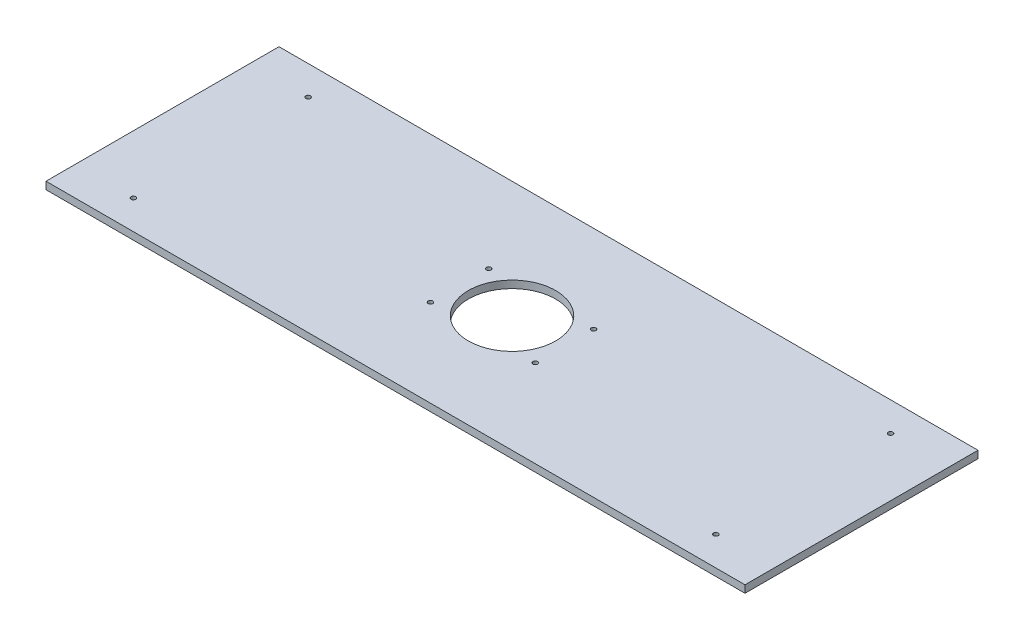
ISO-10303-21;
HEADER;
FILE_DESCRIPTION(('STEP AP214'),'2;1');
FILE_NAME('part.step','',(''),(''),'','','');
FILE_SCHEMA(('AUTOMOTIVE_DESIGN { 1 0 10303 214 1 1 1 1 }'));
ENDSEC;
DATA;
#1=APPLICATION_CONTEXT('core data for automotive mechanical design processes');
#2=APPLICATION_PROTOCOL_DEFINITION('international standard','automotive_design',2000,#1);
#3=PRODUCT_CONTEXT('',#1,'mechanical');
#4=PRODUCT('Part','Part','',(#3));
#5=PRODUCT_RELATED_PRODUCT_CATEGORY('part','',(#4));
#6=PRODUCT_DEFINITION_FORMATION('','',#4);
#7=PRODUCT_DEFINITION_CONTEXT('part definition',#1,'design');
#8=PRODUCT_DEFINITION('design','',#6,#7);
#9=PRODUCT_DEFINITION_SHAPE('','',#8);
#10=(LENGTH_UNIT() NAMED_UNIT(*) SI_UNIT(.MILLI.,.METRE.));
#11=(NAMED_UNIT(*) PLANE_ANGLE_UNIT() SI_UNIT($,.RADIAN.));
#12=(NAMED_UNIT(*) SI_UNIT($,.STERADIAN.) SOLID_ANGLE_UNIT());
#13=UNCERTAINTY_MEASURE_WITH_UNIT(LENGTH_MEASURE(1.E-05),#10,'distance_accuracy_value','');
#14=(GEOMETRIC_REPRESENTATION_CONTEXT(3) GLOBAL_UNCERTAINTY_ASSIGNED_CONTEXT((#13)) GLOBAL_UNIT_ASSIGNED_CONTEXT((#10,
#11,#12)) REPRESENTATION_CONTEXT('',''));
#15=CARTESIAN_POINT('',(0.,0.,0.));
#16=DIRECTION('',(0.,0.,1.));
#17=DIRECTION('',(1.,0.,0.));
#18=AXIS2_PLACEMENT_3D('',#15,#16,#17);
#19=CARTESIAN_POINT('',(0.,12.7,0.));
#20=DIRECTION('',(0.,0.,-1.));
#21=DIRECTION('',(-1.,0.,0.));
#22=AXIS2_PLACEMENT_3D('',#19,#20,#21);
#23=PLANE('',#22);
#24=DIRECTION('',(1.,0.,0.));
#25=VECTOR('',#24,1.);
#26=CARTESIAN_POINT('',(0.,0.,0.));
#27=LINE('',#26,#25);
#28=CARTESIAN_POINT('',(0.,0.,0.));
#29=VERTEX_POINT('',#28);
#30=CARTESIAN_POINT('',(1200.,0.,0.));
#31=VERTEX_POINT('',#30);
#32=EDGE_CURVE('E125',#29,#31,#27,.T.);
#33=ORIENTED_EDGE('',*,*,#32,.T.);
#34=DIRECTION('',(0.,-1.,0.));
#35=VECTOR('',#34,1.);
#36=CARTESIAN_POINT('',(1200.,12.7,0.));
#37=LINE('',#36,#35);
#38=CARTESIAN_POINT('',(1200.,12.7,0.));
#39=VERTEX_POINT('',#38);
#40=EDGE_CURVE('E11',#39,#31,#37,.T.);
#41=ORIENTED_EDGE('',*,*,#40,.F.);
#42=DIRECTION('',(1.,0.,0.));
#43=VECTOR('',#42,1.);
#44=CARTESIAN_POINT('',(0.,12.7,0.));
#45=LINE('',#44,#43);
#46=CARTESIAN_POINT('',(0.,12.7,0.));
#47=VERTEX_POINT('',#46);
#48=EDGE_CURVE('E84',#47,#39,#45,.T.);
#49=ORIENTED_EDGE('',*,*,#48,.F.);
#50=DIRECTION('',(0.,-1.,0.));
#51=VECTOR('',#50,1.);
#52=CARTESIAN_POINT('',(0.,12.7,0.));
#53=LINE('',#52,#51);
#54=EDGE_CURVE('E51',#47,#29,#53,.T.);
#55=ORIENTED_EDGE('',*,*,#54,.T.);
#56=EDGE_LOOP('',(#33,#41,#49,#55));
#57=FACE_BOUND('',#56,.T.);
#58=ADVANCED_FACE('F34',(#57),#23,.F.);
#59=CARTESIAN_POINT('',(1200.,12.7,0.));
#60=DIRECTION('',(-1.,0.,0.));
#61=DIRECTION('',(0.,0.,1.));
#62=AXIS2_PLACEMENT_3D('',#59,#60,#61);
#63=PLANE('',#62);
#64=DIRECTION('',(0.,0.,-1.));
#65=VECTOR('',#64,1.);
#66=CARTESIAN_POINT('',(1200.,0.,0.));
#67=LINE('',#66,#65);
#68=CARTESIAN_POINT('',(1200.,0.,-400.));
#69=VERTEX_POINT('',#68);
#70=EDGE_CURVE('E89',#31,#69,#67,.T.);
#71=ORIENTED_EDGE('',*,*,#70,.T.);
#72=DIRECTION('',(0.,-1.,0.));
#73=VECTOR('',#72,1.);
#74=CARTESIAN_POINT('',(1200.,12.7,-400.));
#75=LINE('',#74,#73);
#76=CARTESIAN_POINT('',(1200.,12.7,-400.));
#77=VERTEX_POINT('',#76);
#78=EDGE_CURVE('E43',#77,#69,#75,.T.);
#79=ORIENTED_EDGE('',*,*,#78,.F.);
#80=DIRECTION('',(0.,0.,-1.));
#81=VECTOR('',#80,1.);
#82=CARTESIAN_POINT('',(1200.,12.7,0.));
#83=LINE('',#82,#81);
#84=EDGE_CURVE('E76',#39,#77,#83,.T.);
#85=ORIENTED_EDGE('',*,*,#84,.F.);
#86=ORIENTED_EDGE('',*,*,#40,.T.);
#87=EDGE_LOOP('',(#71,#79,#85,#86));
#88=FACE_BOUND('',#87,.T.);
#89=ADVANCED_FACE('F88',(#88),#63,.F.);
#90=CARTESIAN_POINT('',(0.,12.7,-400.));
#91=DIRECTION('',(0.,0.,-1.));
#92=DIRECTION('',(-1.,0.,0.));
#93=AXIS2_PLACEMENT_3D('',#90,#91,#92);
#94=PLANE('',#93);
#95=DIRECTION('',(1.,0.,0.));
#96=VECTOR('',#95,1.);
#97=CARTESIAN_POINT('',(0.,0.,-400.));
#98=LINE('',#97,#96);
#99=CARTESIAN_POINT('',(0.,0.,-400.));
#100=VERTEX_POINT('',#99);
#101=EDGE_CURVE('E128',#100,#69,#98,.T.);
#102=ORIENTED_EDGE('',*,*,#101,.F.);
#103=DIRECTION('',(0.,-1.,0.));
#104=VECTOR('',#103,1.);
#105=CARTESIAN_POINT('',(0.,12.7,-400.));
#106=LINE('',#105,#104);
#107=CARTESIAN_POINT('',(0.,12.7,-400.));
#108=VERTEX_POINT('',#107);
#109=EDGE_CURVE('E65',#108,#100,#106,.T.);
#110=ORIENTED_EDGE('',*,*,#109,.F.);
#111=DIRECTION('',(1.,0.,0.));
#112=VECTOR('',#111,1.);
#113=CARTESIAN_POINT('',(0.,12.7,-400.));
#114=LINE('',#113,#112);
#115=EDGE_CURVE('E83',#108,#77,#114,.T.);
#116=ORIENTED_EDGE('',*,*,#115,.T.);
#117=ORIENTED_EDGE('',*,*,#78,.T.);
#118=EDGE_LOOP('',(#102,#110,#116,#117));
#119=FACE_BOUND('',#118,.T.);
#120=ADVANCED_FACE('F92',(#119),#94,.T.);
#121=CARTESIAN_POINT('',(510.,12.7,-150.));
#122=DIRECTION('',(0.,-1.,0.));
#123=DIRECTION('',(0.,0.,-1.));
#124=AXIS2_PLACEMENT_3D('',#121,#122,#123);
#125=CYLINDRICAL_SURFACE('',#124,3.99999999999999);
#126=CARTESIAN_POINT('',(510.,12.7,-150.));
#127=DIRECTION('',(0.,1.,0.));
#128=DIRECTION('',(0.,0.,1.));
#129=AXIS2_PLACEMENT_3D('',#126,#127,#128);
#130=CIRCLE('',#129,3.99999999999999);
#131=CARTESIAN_POINT('',(510.,12.7,-146.));
#132=VERTEX_POINT('',#131);
#133=EDGE_CURVE('E162',#132,#132,#130,.T.);
#134=ORIENTED_EDGE('',*,*,#133,.T.);
#135=EDGE_LOOP('',(#134));
#136=FACE_BOUND('',#135,.T.);
#137=CARTESIAN_POINT('',(510.,0.,-150.));
#138=DIRECTION('',(0.,1.,0.));
#139=DIRECTION('',(0.,0.,1.));
#140=AXIS2_PLACEMENT_3D('',#137,#138,#139);
#141=CIRCLE('',#140,3.99999999999999);
#142=CARTESIAN_POINT('',(510.,0.,-146.));
#143=VERTEX_POINT('',#142);
#144=EDGE_CURVE('E122',#143,#143,#141,.T.);
#145=ORIENTED_EDGE('',*,*,#144,.F.);
#146=EDGE_LOOP('',(#145));
#147=FACE_BOUND('',#146,.T.);
#148=ADVANCED_FACE('F166',(#136,#147),#125,.F.);
#149=CARTESIAN_POINT('',(99.9999999999999,12.7,-350.));
#150=DIRECTION('',(0.,-1.,0.));
#151=DIRECTION('',(0.,0.,-1.));
#152=AXIS2_PLACEMENT_3D('',#149,#150,#151);
#153=CYLINDRICAL_SURFACE('',#152,4.00000000000001);
#154=CARTESIAN_POINT('',(99.9999999999999,12.7,-350.));
#155=DIRECTION('',(0.,1.,0.));
#156=DIRECTION('',(0.,0.,1.));
#157=AXIS2_PLACEMENT_3D('',#154,#155,#156);
#158=CIRCLE('',#157,4.00000000000001);
#159=CARTESIAN_POINT('',(99.9999999999999,12.7,-346.));
#160=VERTEX_POINT('',#159);
#161=EDGE_CURVE('E159',#160,#160,#158,.T.);
#162=ORIENTED_EDGE('',*,*,#161,.T.);
#163=EDGE_LOOP('',(#162));
#164=FACE_BOUND('',#163,.T.);
#165=CARTESIAN_POINT('',(99.9999999999999,0.,-350.));
#166=DIRECTION('',(0.,1.,0.));
#167=DIRECTION('',(0.,0.,1.));
#168=AXIS2_PLACEMENT_3D('',#165,#166,#167);
#169=CIRCLE('',#168,4.00000000000001);
#170=CARTESIAN_POINT('',(99.9999999999999,0.,-346.));
#171=VERTEX_POINT('',#170);
#172=EDGE_CURVE('E119',#171,#171,#169,.T.);
#173=ORIENTED_EDGE('',*,*,#172,.F.);
#174=EDGE_LOOP('',(#173));
#175=FACE_BOUND('',#174,.T.);
#176=ADVANCED_FACE('F192',(#164,#175),#153,.F.);
#177=CARTESIAN_POINT('',(100.,12.7,-50.));
#178=DIRECTION('',(0.,-1.,0.));
#179=DIRECTION('',(0.,0.,-1.));
#180=AXIS2_PLACEMENT_3D('',#177,#178,#179);
#181=CYLINDRICAL_SURFACE('',#180,4.00000000000001);
#182=CARTESIAN_POINT('',(100.,12.7,-50.));
#183=DIRECTION('',(0.,1.,0.));
#184=DIRECTION('',(0.,0.,1.));
#185=AXIS2_PLACEMENT_3D('',#182,#183,#184);
#186=CIRCLE('',#185,4.00000000000001);
#187=CARTESIAN_POINT('',(100.,12.7,-46.));
#188=VERTEX_POINT('',#187);
#189=EDGE_CURVE('E156',#188,#188,#186,.T.);
#190=ORIENTED_EDGE('',*,*,#189,.T.);
#191=EDGE_LOOP('',(#190));
#192=FACE_BOUND('',#191,.T.);
#193=CARTESIAN_POINT('',(100.,0.,-50.));
#194=DIRECTION('',(0.,1.,0.));
#195=DIRECTION('',(0.,0.,1.));
#196=AXIS2_PLACEMENT_3D('',#193,#194,#195);
#197=CIRCLE('',#196,4.00000000000001);
#198=CARTESIAN_POINT('',(100.,0.,-46.));
#199=VERTEX_POINT('',#198);
#200=EDGE_CURVE('E116',#199,#199,#197,.T.);
#201=ORIENTED_EDGE('',*,*,#200,.F.);
#202=EDGE_LOOP('',(#201));
#203=FACE_BOUND('',#202,.T.);
#204=ADVANCED_FACE('F195',(#192,#203),#181,.F.);
#205=CARTESIAN_POINT('',(1100.,12.7,-350.));
#206=DIRECTION('',(0.,-1.,0.));
#207=DIRECTION('',(0.,0.,-1.));
#208=AXIS2_PLACEMENT_3D('',#205,#206,#207);
#209=CYLINDRICAL_SURFACE('',#208,3.99999999999999);
#210=CARTESIAN_POINT('',(1100.,12.7,-350.));
#211=DIRECTION('',(0.,1.,0.));
#212=DIRECTION('',(0.,0.,1.));
#213=AXIS2_PLACEMENT_3D('',#210,#211,#212);
#214=CIRCLE('',#213,3.99999999999999);
#215=CARTESIAN_POINT('',(1100.,12.7,-346.));
#216=VERTEX_POINT('',#215);
#217=EDGE_CURVE('E153',#216,#216,#214,.T.);
#218=ORIENTED_EDGE('',*,*,#217,.T.);
#219=EDGE_LOOP('',(#218));
#220=FACE_BOUND('',#219,.T.);
#221=CARTESIAN_POINT('',(1100.,0.,-350.));
#222=DIRECTION('',(0.,1.,0.));
#223=DIRECTION('',(0.,0.,1.));
#224=AXIS2_PLACEMENT_3D('',#221,#222,#223);
#225=CIRCLE('',#224,3.99999999999999);
#226=CARTESIAN_POINT('',(1100.,0.,-346.));
#227=VERTEX_POINT('',#226);
#228=EDGE_CURVE('E113',#227,#227,#225,.T.);
#229=ORIENTED_EDGE('',*,*,#228,.F.);
#230=EDGE_LOOP('',(#229));
#231=FACE_BOUND('',#230,.T.);
#232=ADVANCED_FACE('F199',(#220,#231),#209,.F.);
#233=CARTESIAN_POINT('',(1100.,12.7,-50.));
#234=DIRECTION('',(0.,-1.,0.));
#235=DIRECTION('',(0.,0.,-1.));
#236=AXIS2_PLACEMENT_3D('',#233,#234,#235);
#237=CYLINDRICAL_SURFACE('',#236,3.99999999999999);
#238=CARTESIAN_POINT('',(1100.,12.7,-50.));
#239=DIRECTION('',(0.,1.,0.));
#240=DIRECTION('',(0.,0.,1.));
#241=AXIS2_PLACEMENT_3D('',#238,#239,#240);
#242=CIRCLE('',#241,3.99999999999999);
#243=CARTESIAN_POINT('',(1100.,12.7,-46.0000000000001));
#244=VERTEX_POINT('',#243);
#245=EDGE_CURVE('E150',#244,#244,#242,.T.);
#246=ORIENTED_EDGE('',*,*,#245,.T.);
#247=EDGE_LOOP('',(#246));
#248=FACE_BOUND('',#247,.T.);
#249=CARTESIAN_POINT('',(1100.,0.,-50.));
#250=DIRECTION('',(0.,1.,0.));
#251=DIRECTION('',(0.,0.,1.));
#252=AXIS2_PLACEMENT_3D('',#249,#250,#251);
#253=CIRCLE('',#252,3.99999999999999);
#254=CARTESIAN_POINT('',(1100.,0.,-46.0000000000001));
#255=VERTEX_POINT('',#254);
#256=EDGE_CURVE('E110',#255,#255,#253,.T.);
#257=ORIENTED_EDGE('',*,*,#256,.F.);
#258=EDGE_LOOP('',(#257));
#259=FACE_BOUND('',#258,.T.);
#260=ADVANCED_FACE('F203',(#248,#259),#237,.F.);
#261=CARTESIAN_POINT('',(510.,12.7,-250.));
#262=DIRECTION('',(0.,-1.,0.));
#263=DIRECTION('',(0.,0.,-1.));
#264=AXIS2_PLACEMENT_3D('',#261,#262,#263);
#265=CYLINDRICAL_SURFACE('',#264,3.99999999999999);
#266=CARTESIAN_POINT('',(510.,12.7,-250.));
#267=DIRECTION('',(0.,1.,0.));
#268=DIRECTION('',(0.,0.,1.));
#269=AXIS2_PLACEMENT_3D('',#266,#267,#268);
#270=CIRCLE('',#269,3.99999999999999);
#271=CARTESIAN_POINT('',(510.,12.7,-246.));
#272=VERTEX_POINT('',#271);
#273=EDGE_CURVE('E147',#272,#272,#270,.T.);
#274=ORIENTED_EDGE('',*,*,#273,.T.);
#275=EDGE_LOOP('',(#274));
#276=FACE_BOUND('',#275,.T.);
#277=CARTESIAN_POINT('',(510.,0.,-250.));
#278=DIRECTION('',(0.,1.,0.));
#279=DIRECTION('',(0.,0.,1.));
#280=AXIS2_PLACEMENT_3D('',#277,#278,#279);
#281=CIRCLE('',#280,3.99999999999999);
#282=CARTESIAN_POINT('',(510.,0.,-246.));
#283=VERTEX_POINT('',#282);
#284=EDGE_CURVE('E107',#283,#283,#281,.T.);
#285=ORIENTED_EDGE('',*,*,#284,.F.);
#286=EDGE_LOOP('',(#285));
#287=FACE_BOUND('',#286,.T.);
#288=ADVANCED_FACE('F207',(#276,#287),#265,.F.);
#289=CARTESIAN_POINT('',(690.,12.7,-150.));
#290=DIRECTION('',(0.,-1.,0.));
#291=DIRECTION('',(0.,0.,-1.));
#292=AXIS2_PLACEMENT_3D('',#289,#290,#291);
#293=CYLINDRICAL_SURFACE('',#292,3.99999999999999);
#294=CARTESIAN_POINT('',(690.,12.7,-150.));
#295=DIRECTION('',(0.,1.,0.));
#296=DIRECTION('',(0.,0.,1.));
#297=AXIS2_PLACEMENT_3D('',#294,#295,#296);
#298=CIRCLE('',#297,3.99999999999999);
#299=CARTESIAN_POINT('',(690.,12.7,-146.));
#300=VERTEX_POINT('',#299);
#301=EDGE_CURVE('E142',#300,#300,#298,.T.);
#302=ORIENTED_EDGE('',*,*,#301,.T.);
#303=EDGE_LOOP('',(#302));
#304=FACE_BOUND('',#303,.T.);
#305=CARTESIAN_POINT('',(690.,0.,-150.));
#306=DIRECTION('',(0.,1.,0.));
#307=DIRECTION('',(0.,0.,1.));
#308=AXIS2_PLACEMENT_3D('',#305,#306,#307);
#309=CIRCLE('',#308,3.99999999999999);
#310=CARTESIAN_POINT('',(690.,0.,-146.));
#311=VERTEX_POINT('',#310);
#312=EDGE_CURVE('E104',#311,#311,#309,.T.);
#313=ORIENTED_EDGE('',*,*,#312,.F.);
#314=EDGE_LOOP('',(#313));
#315=FACE_BOUND('',#314,.T.);
#316=ADVANCED_FACE('F211',(#304,#315),#293,.F.);
#317=CARTESIAN_POINT('',(600.,12.7,-200.));
#318=DIRECTION('',(0.,-1.,0.));
#319=DIRECTION('',(0.,0.,-1.));
#320=AXIS2_PLACEMENT_3D('',#317,#318,#319);
#321=CYLINDRICAL_SURFACE('',#320,75.);
#322=CARTESIAN_POINT('',(600.,12.7,-200.));
#323=DIRECTION('',(0.,1.,0.));
#324=DIRECTION('',(0.,0.,1.));
#325=AXIS2_PLACEMENT_3D('',#322,#323,#324);
#326=CIRCLE('',#325,75.);
#327=CARTESIAN_POINT('',(600.,12.7,-125.));
#328=VERTEX_POINT('',#327);
#329=EDGE_CURVE('E137',#328,#328,#326,.T.);
#330=ORIENTED_EDGE('',*,*,#329,.T.);
#331=EDGE_LOOP('',(#330));
#332=FACE_BOUND('',#331,.T.);
#333=CARTESIAN_POINT('',(600.,0.,-200.));
#334=DIRECTION('',(0.,1.,0.));
#335=DIRECTION('',(0.,0.,1.));
#336=AXIS2_PLACEMENT_3D('',#333,#334,#335);
#337=CIRCLE('',#336,75.);
#338=CARTESIAN_POINT('',(600.,0.,-125.));
#339=VERTEX_POINT('',#338);
#340=EDGE_CURVE('E101',#339,#339,#337,.T.);
#341=ORIENTED_EDGE('',*,*,#340,.F.);
#342=EDGE_LOOP('',(#341));
#343=FACE_BOUND('',#342,.T.);
#344=ADVANCED_FACE('F214',(#332,#343),#321,.F.);
#345=CARTESIAN_POINT('',(690.,12.7,-250.));
#346=DIRECTION('',(0.,-1.,0.));
#347=DIRECTION('',(0.,0.,-1.));
#348=AXIS2_PLACEMENT_3D('',#345,#346,#347);
#349=CYLINDRICAL_SURFACE('',#348,3.99999999999999);
#350=CARTESIAN_POINT('',(690.,12.7,-250.));
#351=DIRECTION('',(0.,1.,0.));
#352=DIRECTION('',(0.,0.,1.));
#353=AXIS2_PLACEMENT_3D('',#350,#351,#352);
#354=CIRCLE('',#353,3.99999999999999);
#355=CARTESIAN_POINT('',(690.,12.7,-246.));
#356=VERTEX_POINT('',#355);
#357=EDGE_CURVE('E133',#356,#356,#354,.T.);
#358=ORIENTED_EDGE('',*,*,#357,.T.);
#359=EDGE_LOOP('',(#358));
#360=FACE_BOUND('',#359,.T.);
#361=CARTESIAN_POINT('',(690.,0.,-250.));
#362=DIRECTION('',(0.,1.,0.));
#363=DIRECTION('',(0.,0.,1.));
#364=AXIS2_PLACEMENT_3D('',#361,#362,#363);
#365=CIRCLE('',#364,3.99999999999999);
#366=CARTESIAN_POINT('',(690.,0.,-246.));
#367=VERTEX_POINT('',#366);
#368=EDGE_CURVE('E98',#367,#367,#365,.T.);
#369=ORIENTED_EDGE('',*,*,#368,.F.);
#370=EDGE_LOOP('',(#369));
#371=FACE_BOUND('',#370,.T.);
#372=ADVANCED_FACE('F36',(#360,#371),#349,.F.);
#373=CARTESIAN_POINT('',(0.,12.7,0.));
#374=DIRECTION('',(-1.,0.,0.));
#375=DIRECTION('',(0.,0.,1.));
#376=AXIS2_PLACEMENT_3D('',#373,#374,#375);
#377=PLANE('',#376);
#378=DIRECTION('',(0.,0.,-1.));
#379=VECTOR('',#378,1.);
#380=CARTESIAN_POINT('',(0.,0.,0.));
#381=LINE('',#380,#379);
#382=EDGE_CURVE('E130',#29,#100,#381,.T.);
#383=ORIENTED_EDGE('',*,*,#382,.F.);
#384=ORIENTED_EDGE('',*,*,#54,.F.);
#385=DIRECTION('',(0.,0.,-1.));
#386=VECTOR('',#385,1.);
#387=CARTESIAN_POINT('',(0.,12.7,0.));
#388=LINE('',#387,#386);
#389=EDGE_CURVE('E93',#47,#108,#388,.T.);
#390=ORIENTED_EDGE('',*,*,#389,.T.);
#391=ORIENTED_EDGE('',*,*,#109,.T.);
#392=EDGE_LOOP('',(#383,#384,#390,#391));
#393=FACE_BOUND('',#392,.T.);
#394=ADVANCED_FACE('F171',(#393),#377,.T.);
#395=CARTESIAN_POINT('',(0.,12.7,0.));
#396=DIRECTION('',(0.,1.,0.));
#397=DIRECTION('',(0.,0.,1.));
#398=AXIS2_PLACEMENT_3D('',#395,#396,#397);
#399=PLANE('',#398);
#400=ORIENTED_EDGE('',*,*,#357,.F.);
#401=EDGE_LOOP('',(#400));
#402=FACE_BOUND('',#401,.T.);
#403=ORIENTED_EDGE('',*,*,#329,.F.);
#404=EDGE_LOOP('',(#403));
#405=FACE_BOUND('',#404,.T.);
#406=ORIENTED_EDGE('',*,*,#301,.F.);
#407=EDGE_LOOP('',(#406));
#408=FACE_BOUND('',#407,.T.);
#409=ORIENTED_EDGE('',*,*,#273,.F.);
#410=EDGE_LOOP('',(#409));
#411=FACE_BOUND('',#410,.T.);
#412=ORIENTED_EDGE('',*,*,#245,.F.);
#413=EDGE_LOOP('',(#412));
#414=FACE_BOUND('',#413,.T.);
#415=ORIENTED_EDGE('',*,*,#217,.F.);
#416=EDGE_LOOP('',(#415));
#417=FACE_BOUND('',#416,.T.);
#418=ORIENTED_EDGE('',*,*,#189,.F.);
#419=EDGE_LOOP('',(#418));
#420=FACE_BOUND('',#419,.T.);
#421=ORIENTED_EDGE('',*,*,#161,.F.);
#422=EDGE_LOOP('',(#421));
#423=FACE_BOUND('',#422,.T.);
#424=ORIENTED_EDGE('',*,*,#133,.F.);
#425=EDGE_LOOP('',(#424));
#426=FACE_BOUND('',#425,.T.);
#427=ORIENTED_EDGE('',*,*,#48,.T.);
#428=ORIENTED_EDGE('',*,*,#84,.T.);
#429=ORIENTED_EDGE('',*,*,#115,.F.);
#430=ORIENTED_EDGE('',*,*,#389,.F.);
#431=EDGE_LOOP('',(#427,#428,#429,#430));
#432=FACE_BOUND('',#431,.T.);
#433=ADVANCED_FACE('F80',(#402,#405,#408,#411,#414,#417,#420,#423,#426,#432),#399,.T.);
#434=CARTESIAN_POINT('',(0.,0.,0.));
#435=DIRECTION('',(0.,1.,0.));
#436=DIRECTION('',(0.,0.,1.));
#437=AXIS2_PLACEMENT_3D('',#434,#435,#436);
#438=PLANE('',#437);
#439=ORIENTED_EDGE('',*,*,#368,.T.);
#440=EDGE_LOOP('',(#439));
#441=FACE_BOUND('',#440,.T.);
#442=ORIENTED_EDGE('',*,*,#340,.T.);
#443=EDGE_LOOP('',(#442));
#444=FACE_BOUND('',#443,.T.);
#445=ORIENTED_EDGE('',*,*,#312,.T.);
#446=EDGE_LOOP('',(#445));
#447=FACE_BOUND('',#446,.T.);
#448=ORIENTED_EDGE('',*,*,#284,.T.);
#449=EDGE_LOOP('',(#448));
#450=FACE_BOUND('',#449,.T.);
#451=ORIENTED_EDGE('',*,*,#256,.T.);
#452=EDGE_LOOP('',(#451));
#453=FACE_BOUND('',#452,.T.);
#454=ORIENTED_EDGE('',*,*,#228,.T.);
#455=EDGE_LOOP('',(#454));
#456=FACE_BOUND('',#455,.T.);
#457=ORIENTED_EDGE('',*,*,#200,.T.);
#458=EDGE_LOOP('',(#457));
#459=FACE_BOUND('',#458,.T.);
#460=ORIENTED_EDGE('',*,*,#172,.T.);
#461=EDGE_LOOP('',(#460));
#462=FACE_BOUND('',#461,.T.);
#463=ORIENTED_EDGE('',*,*,#144,.T.);
#464=EDGE_LOOP('',(#463));
#465=FACE_BOUND('',#464,.T.);
#466=ORIENTED_EDGE('',*,*,#32,.F.);
#467=ORIENTED_EDGE('',*,*,#382,.T.);
#468=ORIENTED_EDGE('',*,*,#101,.T.);
#469=ORIENTED_EDGE('',*,*,#70,.F.);
#470=EDGE_LOOP('',(#466,#467,#468,#469));
#471=FACE_BOUND('',#470,.T.);
#472=ADVANCED_FACE('F170',(#441,#444,#447,#450,#453,#456,#459,#462,#465,#471),#438,.F.);
#473=CLOSED_SHELL('',(#58,#89,#120,#148,#176,#204,#232,#260,#288,#316,#344,#372,#394,#433,#472));
#474=MANIFOLD_SOLID_BREP('B2',#473);
#475=ADVANCED_BREP_SHAPE_REPRESENTATION('',(#18,#474),#14);
#476=SHAPE_DEFINITION_REPRESENTATION(#9,#475);
ENDSEC;
END-ISO-10303-21;
